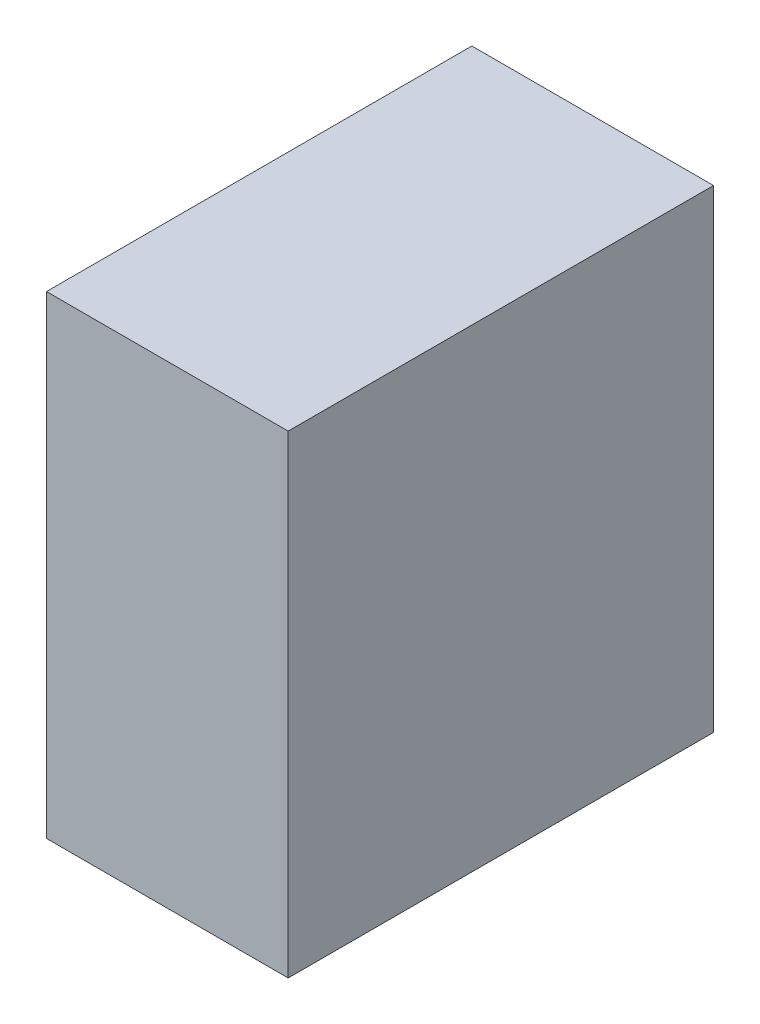
ISO-10303-21;
HEADER;
FILE_DESCRIPTION(('STEP AP214'),'2;1');
FILE_NAME('part.step','',(''),(''),'','','');
FILE_SCHEMA(('AUTOMOTIVE_DESIGN { 1 0 10303 214 1 1 1 1 }'));
ENDSEC;
DATA;
#1=APPLICATION_CONTEXT('core data for automotive mechanical design processes');
#2=APPLICATION_PROTOCOL_DEFINITION('international standard','automotive_design',2000,#1);
#3=PRODUCT_CONTEXT('',#1,'mechanical');
#4=PRODUCT('Part','Part','',(#3));
#5=PRODUCT_RELATED_PRODUCT_CATEGORY('part','',(#4));
#6=PRODUCT_DEFINITION_FORMATION('','',#4);
#7=PRODUCT_DEFINITION_CONTEXT('part definition',#1,'design');
#8=PRODUCT_DEFINITION('design','',#6,#7);
#9=PRODUCT_DEFINITION_SHAPE('','',#8);
#10=(LENGTH_UNIT() NAMED_UNIT(*) SI_UNIT(.MILLI.,.METRE.));
#11=(NAMED_UNIT(*) PLANE_ANGLE_UNIT() SI_UNIT($,.RADIAN.));
#12=(NAMED_UNIT(*) SI_UNIT($,.STERADIAN.) SOLID_ANGLE_UNIT());
#13=UNCERTAINTY_MEASURE_WITH_UNIT(LENGTH_MEASURE(1.E-05),#10,'distance_accuracy_value','');
#14=(GEOMETRIC_REPRESENTATION_CONTEXT(3) GLOBAL_UNCERTAINTY_ASSIGNED_CONTEXT((#13)) GLOBAL_UNIT_ASSIGNED_CONTEXT((#10,
#11,#12)) REPRESENTATION_CONTEXT('',''));
#15=CARTESIAN_POINT('',(0.,0.,0.));
#16=DIRECTION('',(0.,0.,1.));
#17=DIRECTION('',(1.,0.,0.));
#18=AXIS2_PLACEMENT_3D('',#15,#16,#17);
#19=CARTESIAN_POINT('',(125.,-122.5,-110.));
#20=DIRECTION('',(0.,0.,1.));
#21=DIRECTION('',(1.,0.,0.));
#22=AXIS2_PLACEMENT_3D('',#19,#20,#21);
#23=PLANE('',#22);
#24=DIRECTION('',(0.,1.,0.));
#25=VECTOR('',#24,1.);
#26=CARTESIAN_POINT('',(0.,-122.5,-110.));
#27=LINE('',#26,#25);
#28=CARTESIAN_POINT('',(0.,-122.5,-110.));
#29=VERTEX_POINT('',#28);
#30=CARTESIAN_POINT('',(0.,122.5,-110.));
#31=VERTEX_POINT('',#30);
#32=EDGE_CURVE('E96',#29,#31,#27,.T.);
#33=ORIENTED_EDGE('',*,*,#32,.T.);
#34=DIRECTION('',(-1.,0.,0.));
#35=VECTOR('',#34,1.);
#36=CARTESIAN_POINT('',(125.,122.5,-110.));
#37=LINE('',#36,#35);
#38=CARTESIAN_POINT('',(125.,122.5,-110.));
#39=VERTEX_POINT('',#38);
#40=EDGE_CURVE('E11',#39,#31,#37,.T.);
#41=ORIENTED_EDGE('',*,*,#40,.F.);
#42=DIRECTION('',(0.,1.,0.));
#43=VECTOR('',#42,1.);
#44=CARTESIAN_POINT('',(125.,-122.5,-110.));
#45=LINE('',#44,#43);
#46=CARTESIAN_POINT('',(125.,-122.5,-110.));
#47=VERTEX_POINT('',#46);
#48=EDGE_CURVE('E84',#47,#39,#45,.T.);
#49=ORIENTED_EDGE('',*,*,#48,.F.);
#50=DIRECTION('',(-1.,0.,0.));
#51=VECTOR('',#50,1.);
#52=CARTESIAN_POINT('',(125.,-122.5,-110.));
#53=LINE('',#52,#51);
#54=EDGE_CURVE('E92',#47,#29,#53,.T.);
#55=ORIENTED_EDGE('',*,*,#54,.T.);
#56=EDGE_LOOP('',(#33,#41,#49,#55));
#57=FACE_BOUND('',#56,.T.);
#58=ADVANCED_FACE('F33',(#57),#23,.F.);
#59=CARTESIAN_POINT('',(125.,122.5,110.));
#60=DIRECTION('',(0.,-1.,0.));
#61=DIRECTION('',(0.,0.,-1.));
#62=AXIS2_PLACEMENT_3D('',#59,#60,#61);
#63=PLANE('',#62);
#64=DIRECTION('',(0.,0.,1.));
#65=VECTOR('',#64,1.);
#66=CARTESIAN_POINT('',(0.,122.5,110.));
#67=LINE('',#66,#65);
#68=CARTESIAN_POINT('',(0.,122.5,110.));
#69=VERTEX_POINT('',#68);
#70=EDGE_CURVE('E88',#31,#69,#67,.T.);
#71=ORIENTED_EDGE('',*,*,#70,.T.);
#72=DIRECTION('',(-1.,0.,0.));
#73=VECTOR('',#72,1.);
#74=CARTESIAN_POINT('',(125.,122.5,110.));
#75=LINE('',#74,#73);
#76=CARTESIAN_POINT('',(125.,122.5,110.));
#77=VERTEX_POINT('',#76);
#78=EDGE_CURVE('E41',#77,#69,#75,.T.);
#79=ORIENTED_EDGE('',*,*,#78,.F.);
#80=DIRECTION('',(0.,0.,1.));
#81=VECTOR('',#80,1.);
#82=CARTESIAN_POINT('',(125.,122.5,110.));
#83=LINE('',#82,#81);
#84=EDGE_CURVE('E79',#39,#77,#83,.T.);
#85=ORIENTED_EDGE('',*,*,#84,.F.);
#86=ORIENTED_EDGE('',*,*,#40,.T.);
#87=EDGE_LOOP('',(#71,#79,#85,#86));
#88=FACE_BOUND('',#87,.T.);
#89=ADVANCED_FACE('F87',(#88),#63,.F.);
#90=CARTESIAN_POINT('',(125.,-122.5,110.));
#91=DIRECTION('',(0.,0.,-1.));
#92=DIRECTION('',(-1.,0.,0.));
#93=AXIS2_PLACEMENT_3D('',#90,#91,#92);
#94=PLANE('',#93);
#95=DIRECTION('',(0.,-1.,0.));
#96=VECTOR('',#95,1.);
#97=CARTESIAN_POINT('',(0.,-122.5,110.));
#98=LINE('',#97,#96);
#99=CARTESIAN_POINT('',(0.,-122.5,110.));
#100=VERTEX_POINT('',#99);
#101=EDGE_CURVE('E66',#69,#100,#98,.T.);
#102=ORIENTED_EDGE('',*,*,#101,.T.);
#103=DIRECTION('',(-1.,0.,0.));
#104=VECTOR('',#103,1.);
#105=CARTESIAN_POINT('',(125.,-122.5,110.));
#106=LINE('',#105,#104);
#107=CARTESIAN_POINT('',(125.,-122.5,110.));
#108=VERTEX_POINT('',#107);
#109=EDGE_CURVE('E89',#108,#100,#106,.T.);
#110=ORIENTED_EDGE('',*,*,#109,.F.);
#111=DIRECTION('',(0.,-1.,0.));
#112=VECTOR('',#111,1.);
#113=CARTESIAN_POINT('',(125.,-122.5,110.));
#114=LINE('',#113,#112);
#115=EDGE_CURVE('E82',#77,#108,#114,.T.);
#116=ORIENTED_EDGE('',*,*,#115,.F.);
#117=ORIENTED_EDGE('',*,*,#78,.T.);
#118=EDGE_LOOP('',(#102,#110,#116,#117));
#119=FACE_BOUND('',#118,.T.);
#120=ADVANCED_FACE('F90',(#119),#94,.F.);
#121=CARTESIAN_POINT('',(125.,-122.5,110.));
#122=DIRECTION('',(0.,1.,0.));
#123=DIRECTION('',(0.,0.,1.));
#124=AXIS2_PLACEMENT_3D('',#121,#122,#123);
#125=PLANE('',#124);
#126=DIRECTION('',(0.,0.,-1.));
#127=VECTOR('',#126,1.);
#128=CARTESIAN_POINT('',(0.,-122.5,110.));
#129=LINE('',#128,#127);
#130=EDGE_CURVE('E72',#100,#29,#129,.T.);
#131=ORIENTED_EDGE('',*,*,#130,.T.);
#132=ORIENTED_EDGE('',*,*,#54,.F.);
#133=DIRECTION('',(0.,0.,-1.));
#134=VECTOR('',#133,1.);
#135=CARTESIAN_POINT('',(125.,-122.5,110.));
#136=LINE('',#135,#134);
#137=EDGE_CURVE('E49',#108,#47,#136,.T.);
#138=ORIENTED_EDGE('',*,*,#137,.F.);
#139=ORIENTED_EDGE('',*,*,#109,.T.);
#140=EDGE_LOOP('',(#131,#132,#138,#139));
#141=FACE_BOUND('',#140,.T.);
#142=ADVANCED_FACE('F103',(#141),#125,.F.);
#143=CARTESIAN_POINT('',(125.,0.,0.));
#144=DIRECTION('',(-1.,0.,0.));
#145=DIRECTION('',(0.,0.,1.));
#146=AXIS2_PLACEMENT_3D('',#143,#144,#145);
#147=PLANE('',#146);
#148=ORIENTED_EDGE('',*,*,#48,.T.);
#149=ORIENTED_EDGE('',*,*,#84,.T.);
#150=ORIENTED_EDGE('',*,*,#115,.T.);
#151=ORIENTED_EDGE('',*,*,#137,.T.);
#152=EDGE_LOOP('',(#148,#149,#150,#151));
#153=FACE_BOUND('',#152,.T.);
#154=ADVANCED_FACE('F80',(#153),#147,.F.);
#155=CARTESIAN_POINT('',(0.,0.,0.));
#156=DIRECTION('',(-1.,0.,0.));
#157=DIRECTION('',(0.,0.,1.));
#158=AXIS2_PLACEMENT_3D('',#155,#156,#157);
#159=PLANE('',#158);
#160=ORIENTED_EDGE('',*,*,#32,.F.);
#161=ORIENTED_EDGE('',*,*,#130,.F.);
#162=ORIENTED_EDGE('',*,*,#101,.F.);
#163=ORIENTED_EDGE('',*,*,#70,.F.);
#164=EDGE_LOOP('',(#160,#161,#162,#163));
#165=FACE_BOUND('',#164,.T.);
#166=ADVANCED_FACE('F106',(#165),#159,.T.);
#167=CLOSED_SHELL('',(#58,#89,#120,#142,#154,#166));
#168=MANIFOLD_SOLID_BREP('B2',#167);
#169=ADVANCED_BREP_SHAPE_REPRESENTATION('',(#18,#168),#14);
#170=SHAPE_DEFINITION_REPRESENTATION(#9,#169);
ENDSEC;
END-ISO-10303-21;
